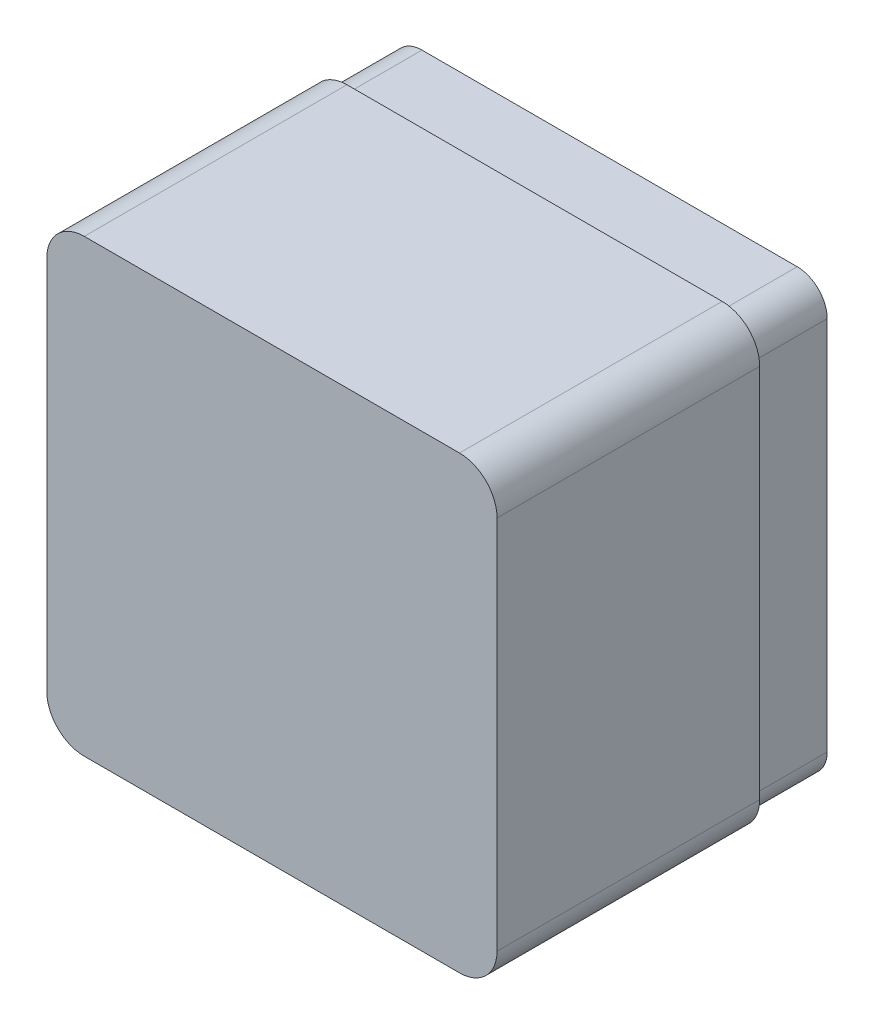
ISO-10303-21;
HEADER;
FILE_DESCRIPTION(('STEP AP214'),'2;1');
FILE_NAME('part.step','',(''),(''),'','','');
FILE_SCHEMA(('AUTOMOTIVE_DESIGN { 1 0 10303 214 1 1 1 1 }'));
ENDSEC;
DATA;
#1=APPLICATION_CONTEXT('core data for automotive mechanical design processes');
#2=APPLICATION_PROTOCOL_DEFINITION('international standard','automotive_design',2000,#1);
#3=PRODUCT_CONTEXT('',#1,'mechanical');
#4=PRODUCT('Part','Part','',(#3));
#5=PRODUCT_RELATED_PRODUCT_CATEGORY('part','',(#4));
#6=PRODUCT_DEFINITION_FORMATION('','',#4);
#7=PRODUCT_DEFINITION_CONTEXT('part definition',#1,'design');
#8=PRODUCT_DEFINITION('design','',#6,#7);
#9=PRODUCT_DEFINITION_SHAPE('','',#8);
#10=(LENGTH_UNIT() NAMED_UNIT(*) SI_UNIT(.MILLI.,.METRE.));
#11=(NAMED_UNIT(*) PLANE_ANGLE_UNIT() SI_UNIT($,.RADIAN.));
#12=(NAMED_UNIT(*) SI_UNIT($,.STERADIAN.) SOLID_ANGLE_UNIT());
#13=UNCERTAINTY_MEASURE_WITH_UNIT(LENGTH_MEASURE(1.E-05),#10,'distance_accuracy_value','');
#14=(GEOMETRIC_REPRESENTATION_CONTEXT(3) GLOBAL_UNCERTAINTY_ASSIGNED_CONTEXT((#13)) GLOBAL_UNIT_ASSIGNED_CONTEXT((#10,
#11,#12)) REPRESENTATION_CONTEXT('',''));
#15=CARTESIAN_POINT('',(0.,0.,0.));
#16=DIRECTION('',(0.,0.,1.));
#17=DIRECTION('',(1.,0.,0.));
#18=AXIS2_PLACEMENT_3D('',#15,#16,#17);
#19=CARTESIAN_POINT('',(0.,0.,0.));
#20=DIRECTION('',(0.,0.,-1.));
#21=DIRECTION('',(-1.,0.,0.));
#22=AXIS2_PLACEMENT_3D('',#19,#20,#21);
#23=PLANE('',#22);
#24=CARTESIAN_POINT('',(10.,10.,0.));
#25=DIRECTION('',(0.,0.,-1.));
#26=DIRECTION('',(-1.,0.,0.));
#27=AXIS2_PLACEMENT_3D('',#24,#25,#26);
#28=CIRCLE('',#27,6.);
#29=CARTESIAN_POINT('',(10.,4.,0.));
#30=VERTEX_POINT('',#29);
#31=CARTESIAN_POINT('',(4.,9.99999999999999,0.));
#32=VERTEX_POINT('',#31);
#33=EDGE_CURVE('E334',#30,#32,#28,.T.);
#34=ORIENTED_EDGE('',*,*,#33,.F.);
#35=DIRECTION('',(1.,0.,0.));
#36=VECTOR('',#35,1.);
#37=CARTESIAN_POINT('',(0.,4.,0.));
#38=LINE('',#37,#36);
#39=CARTESIAN_POINT('',(110.,4.,0.));
#40=VERTEX_POINT('',#39);
#41=EDGE_CURVE('E381',#30,#40,#38,.T.);
#42=ORIENTED_EDGE('',*,*,#41,.T.);
#43=CARTESIAN_POINT('',(110.,10.,0.));
#44=DIRECTION('',(0.,0.,-1.));
#45=DIRECTION('',(-1.,0.,0.));
#46=AXIS2_PLACEMENT_3D('',#43,#44,#45);
#47=CIRCLE('',#46,6.);
#48=CARTESIAN_POINT('',(116.,10.,0.));
#49=VERTEX_POINT('',#48);
#50=EDGE_CURVE('E391',#49,#40,#47,.T.);
#51=ORIENTED_EDGE('',*,*,#50,.F.);
#52=DIRECTION('',(0.,1.,0.));
#53=VECTOR('',#52,1.);
#54=CARTESIAN_POINT('',(116.,0.,0.));
#55=LINE('',#54,#53);
#56=CARTESIAN_POINT('',(116.,110.,0.));
#57=VERTEX_POINT('',#56);
#58=EDGE_CURVE('E388',#49,#57,#55,.T.);
#59=ORIENTED_EDGE('',*,*,#58,.T.);
#60=CARTESIAN_POINT('',(110.,110.,0.));
#61=DIRECTION('',(0.,0.,-1.));
#62=DIRECTION('',(-1.,0.,0.));
#63=AXIS2_PLACEMENT_3D('',#60,#61,#62);
#64=CIRCLE('',#63,6.);
#65=CARTESIAN_POINT('',(110.,116.,0.));
#66=VERTEX_POINT('',#65);
#67=EDGE_CURVE('E384',#66,#57,#64,.T.);
#68=ORIENTED_EDGE('',*,*,#67,.F.);
#69=DIRECTION('',(-1.,0.,0.));
#70=VECTOR('',#69,1.);
#71=CARTESIAN_POINT('',(0.,116.,0.));
#72=LINE('',#71,#70);
#73=CARTESIAN_POINT('',(9.99999999999999,116.,0.));
#74=VERTEX_POINT('',#73);
#75=EDGE_CURVE('E331',#66,#74,#72,.T.);
#76=ORIENTED_EDGE('',*,*,#75,.T.);
#77=CARTESIAN_POINT('',(10.,110.,0.));
#78=DIRECTION('',(0.,0.,-1.));
#79=DIRECTION('',(-1.,0.,0.));
#80=AXIS2_PLACEMENT_3D('',#77,#78,#79);
#81=CIRCLE('',#80,6.);
#82=CARTESIAN_POINT('',(4.,110.,0.));
#83=VERTEX_POINT('',#82);
#84=EDGE_CURVE('E362',#83,#74,#81,.T.);
#85=ORIENTED_EDGE('',*,*,#84,.F.);
#86=DIRECTION('',(0.,-1.,0.));
#87=VECTOR('',#86,1.);
#88=CARTESIAN_POINT('',(4.,0.,0.));
#89=LINE('',#88,#87);
#90=EDGE_CURVE('E320',#83,#32,#89,.T.);
#91=ORIENTED_EDGE('',*,*,#90,.T.);
#92=EDGE_LOOP('',(#34,#42,#51,#59,#68,#76,#85,#91));
#93=FACE_BOUND('',#92,.T.);
#94=DIRECTION('',(0.,-1.,0.));
#95=VECTOR('',#94,1.);
#96=CARTESIAN_POINT('',(118.,110.,0.));
#97=LINE('',#96,#95);
#98=CARTESIAN_POINT('',(118.,110.,0.));
#99=VERTEX_POINT('',#98);
#100=CARTESIAN_POINT('',(118.,9.99999999999999,0.));
#101=VERTEX_POINT('',#100);
#102=EDGE_CURVE('E229',#99,#101,#97,.T.);
#103=ORIENTED_EDGE('',*,*,#102,.T.);
#104=CARTESIAN_POINT('',(110.,10.,0.));
#105=DIRECTION('',(0.,0.,-1.));
#106=DIRECTION('',(-1.,0.,0.));
#107=AXIS2_PLACEMENT_3D('',#104,#105,#106);
#108=CIRCLE('',#107,7.99999999999998);
#109=CARTESIAN_POINT('',(110.,2.,0.));
#110=VERTEX_POINT('',#109);
#111=EDGE_CURVE('E256',#101,#110,#108,.T.);
#112=ORIENTED_EDGE('',*,*,#111,.T.);
#113=DIRECTION('',(-1.,0.,0.));
#114=VECTOR('',#113,1.);
#115=CARTESIAN_POINT('',(110.,2.,0.));
#116=LINE('',#115,#114);
#117=CARTESIAN_POINT('',(9.99999999999999,2.,0.));
#118=VERTEX_POINT('',#117);
#119=EDGE_CURVE('E206',#110,#118,#116,.T.);
#120=ORIENTED_EDGE('',*,*,#119,.T.);
#121=CARTESIAN_POINT('',(10.,10.,0.));
#122=DIRECTION('',(0.,0.,-1.));
#123=DIRECTION('',(-1.,0.,0.));
#124=AXIS2_PLACEMENT_3D('',#121,#122,#123);
#125=CIRCLE('',#124,8.);
#126=CARTESIAN_POINT('',(2.,10.,0.));
#127=VERTEX_POINT('',#126);
#128=EDGE_CURVE('E54',#118,#127,#125,.T.);
#129=ORIENTED_EDGE('',*,*,#128,.T.);
#130=DIRECTION('',(0.,1.,0.));
#131=VECTOR('',#130,1.);
#132=CARTESIAN_POINT('',(2.,10.,0.));
#133=LINE('',#132,#131);
#134=CARTESIAN_POINT('',(2.,110.,0.));
#135=VERTEX_POINT('',#134);
#136=EDGE_CURVE('E263',#127,#135,#133,.T.);
#137=ORIENTED_EDGE('',*,*,#136,.T.);
#138=CARTESIAN_POINT('',(10.,110.,0.));
#139=DIRECTION('',(0.,0.,-1.));
#140=DIRECTION('',(-1.,0.,0.));
#141=AXIS2_PLACEMENT_3D('',#138,#139,#140);
#142=CIRCLE('',#141,8.);
#143=CARTESIAN_POINT('',(10.,118.,0.));
#144=VERTEX_POINT('',#143);
#145=EDGE_CURVE('E267',#135,#144,#142,.T.);
#146=ORIENTED_EDGE('',*,*,#145,.T.);
#147=DIRECTION('',(1.,0.,0.));
#148=VECTOR('',#147,1.);
#149=CARTESIAN_POINT('',(10.,118.,0.));
#150=LINE('',#149,#148);
#151=CARTESIAN_POINT('',(110.,118.,0.));
#152=VERTEX_POINT('',#151);
#153=EDGE_CURVE('E271',#144,#152,#150,.T.);
#154=ORIENTED_EDGE('',*,*,#153,.T.);
#155=CARTESIAN_POINT('',(110.,110.,0.));
#156=DIRECTION('',(0.,0.,-1.));
#157=DIRECTION('',(-1.,0.,0.));
#158=AXIS2_PLACEMENT_3D('',#155,#156,#157);
#159=CIRCLE('',#158,7.99999999999999);
#160=EDGE_CURVE('E233',#152,#99,#159,.T.);
#161=ORIENTED_EDGE('',*,*,#160,.T.);
#162=EDGE_LOOP('',(#103,#112,#120,#129,#137,#146,#154,#161));
#163=FACE_BOUND('',#162,.T.);
#164=ADVANCED_FACE('F38',(#93,#163),#23,.T.);
#165=CARTESIAN_POINT('',(4.,0.,90.));
#166=DIRECTION('',(1.,0.,0.));
#167=DIRECTION('',(0.,0.,-1.));
#168=AXIS2_PLACEMENT_3D('',#165,#166,#167);
#169=PLANE('',#168);
#170=ORIENTED_EDGE('',*,*,#90,.F.);
#171=DIRECTION('',(0.,0.,-1.));
#172=VECTOR('',#171,1.);
#173=CARTESIAN_POINT('',(4.,110.,90.));
#174=LINE('',#173,#172);
#175=CARTESIAN_POINT('',(4.,110.,86.));
#176=VERTEX_POINT('',#175);
#177=EDGE_CURVE('E325',#176,#83,#174,.T.);
#178=ORIENTED_EDGE('',*,*,#177,.F.);
#179=DIRECTION('',(0.,-1.,0.));
#180=VECTOR('',#179,1.);
#181=CARTESIAN_POINT('',(4.,0.,86.));
#182=LINE('',#181,#180);
#183=CARTESIAN_POINT('',(4.,9.99999999999999,86.));
#184=VERTEX_POINT('',#183);
#185=EDGE_CURVE('E326',#176,#184,#182,.T.);
#186=ORIENTED_EDGE('',*,*,#185,.T.);
#187=DIRECTION('',(0.,0.,-1.));
#188=VECTOR('',#187,1.);
#189=CARTESIAN_POINT('',(4.,9.99999999999999,90.));
#190=LINE('',#189,#188);
#191=EDGE_CURVE('E321',#32,#184,#190,.F.);
#192=ORIENTED_EDGE('',*,*,#191,.F.);
#193=EDGE_LOOP('',(#170,#178,#186,#192));
#194=FACE_BOUND('',#193,.T.);
#195=ADVANCED_FACE('F504',(#194),#169,.T.);
#196=CARTESIAN_POINT('',(0.,4.,90.));
#197=DIRECTION('',(0.,1.,0.));
#198=DIRECTION('',(0.,0.,1.));
#199=AXIS2_PLACEMENT_3D('',#196,#197,#198);
#200=PLANE('',#199);
#201=DIRECTION('',(1.,0.,0.));
#202=VECTOR('',#201,1.);
#203=CARTESIAN_POINT('',(0.,4.,86.));
#204=LINE('',#203,#202);
#205=CARTESIAN_POINT('',(9.99999999999999,4.,86.));
#206=VERTEX_POINT('',#205);
#207=CARTESIAN_POINT('',(110.,4.,86.));
#208=VERTEX_POINT('',#207);
#209=EDGE_CURVE('E330',#206,#208,#204,.T.);
#210=ORIENTED_EDGE('',*,*,#209,.T.);
#211=DIRECTION('',(0.,0.,1.));
#212=VECTOR('',#211,1.);
#213=CARTESIAN_POINT('',(110.,4.,90.));
#214=LINE('',#213,#212);
#215=EDGE_CURVE('E356',#40,#208,#214,.T.);
#216=ORIENTED_EDGE('',*,*,#215,.F.);
#217=ORIENTED_EDGE('',*,*,#41,.F.);
#218=DIRECTION('',(0.,0.,1.));
#219=VECTOR('',#218,1.);
#220=CARTESIAN_POINT('',(9.99999999999999,4.,90.));
#221=LINE('',#220,#219);
#222=EDGE_CURVE('E359',#206,#30,#221,.F.);
#223=ORIENTED_EDGE('',*,*,#222,.F.);
#224=EDGE_LOOP('',(#210,#216,#217,#223));
#225=FACE_BOUND('',#224,.T.);
#226=ADVANCED_FACE('F511',(#225),#200,.T.);
#227=CARTESIAN_POINT('',(116.,0.,90.));
#228=DIRECTION('',(-1.,0.,0.));
#229=DIRECTION('',(0.,-1.,0.));
#230=AXIS2_PLACEMENT_3D('',#227,#228,#229);
#231=PLANE('',#230);
#232=DIRECTION('',(0.,1.,0.));
#233=VECTOR('',#232,1.);
#234=CARTESIAN_POINT('',(116.,0.,86.));
#235=LINE('',#234,#233);
#236=CARTESIAN_POINT('',(116.,10.,86.));
#237=VERTEX_POINT('',#236);
#238=CARTESIAN_POINT('',(116.,110.,86.));
#239=VERTEX_POINT('',#238);
#240=EDGE_CURVE('E343',#237,#239,#235,.T.);
#241=ORIENTED_EDGE('',*,*,#240,.T.);
#242=DIRECTION('',(0.,0.,1.));
#243=VECTOR('',#242,1.);
#244=CARTESIAN_POINT('',(116.,110.,90.));
#245=LINE('',#244,#243);
#246=EDGE_CURVE('E338',#57,#239,#245,.T.);
#247=ORIENTED_EDGE('',*,*,#246,.F.);
#248=ORIENTED_EDGE('',*,*,#58,.F.);
#249=DIRECTION('',(0.,0.,1.));
#250=VECTOR('',#249,1.);
#251=CARTESIAN_POINT('',(116.,10.,90.));
#252=LINE('',#251,#250);
#253=EDGE_CURVE('E365',#237,#49,#252,.F.);
#254=ORIENTED_EDGE('',*,*,#253,.F.);
#255=EDGE_LOOP('',(#241,#247,#248,#254));
#256=FACE_BOUND('',#255,.T.);
#257=ADVANCED_FACE('F685',(#256),#231,.T.);
#258=CARTESIAN_POINT('',(0.,116.,90.));
#259=DIRECTION('',(0.,-1.,0.));
#260=DIRECTION('',(0.,0.,-1.));
#261=AXIS2_PLACEMENT_3D('',#258,#259,#260);
#262=PLANE('',#261);
#263=DIRECTION('',(-1.,0.,0.));
#264=VECTOR('',#263,1.);
#265=CARTESIAN_POINT('',(0.,116.,86.));
#266=LINE('',#265,#264);
#267=CARTESIAN_POINT('',(110.,116.,86.));
#268=VERTEX_POINT('',#267);
#269=CARTESIAN_POINT('',(9.99999999999999,116.,86.));
#270=VERTEX_POINT('',#269);
#271=EDGE_CURVE('E350',#268,#270,#266,.T.);
#272=ORIENTED_EDGE('',*,*,#271,.T.);
#273=DIRECTION('',(0.,0.,-1.));
#274=VECTOR('',#273,1.);
#275=CARTESIAN_POINT('',(9.99999999999999,116.,90.));
#276=LINE('',#275,#274);
#277=EDGE_CURVE('E369',#74,#270,#276,.F.);
#278=ORIENTED_EDGE('',*,*,#277,.F.);
#279=ORIENTED_EDGE('',*,*,#75,.F.);
#280=DIRECTION('',(0.,0.,-1.));
#281=VECTOR('',#280,1.);
#282=CARTESIAN_POINT('',(110.,116.,90.));
#283=LINE('',#282,#281);
#284=EDGE_CURVE('E372',#268,#66,#283,.T.);
#285=ORIENTED_EDGE('',*,*,#284,.F.);
#286=EDGE_LOOP('',(#272,#278,#279,#285));
#287=FACE_BOUND('',#286,.T.);
#288=ADVANCED_FACE('F677',(#287),#262,.T.);
#289=CARTESIAN_POINT('',(0.,0.,86.));
#290=DIRECTION('',(0.,0.,-1.));
#291=DIRECTION('',(-1.,0.,0.));
#292=AXIS2_PLACEMENT_3D('',#289,#290,#291);
#293=PLANE('',#292);
#294=ORIENTED_EDGE('',*,*,#185,.F.);
#295=CARTESIAN_POINT('',(10.,110.,86.));
#296=DIRECTION('',(0.,0.,-1.));
#297=DIRECTION('',(-1.,0.,0.));
#298=AXIS2_PLACEMENT_3D('',#295,#296,#297);
#299=CIRCLE('',#298,6.);
#300=EDGE_CURVE('E324',#270,#176,#299,.F.);
#301=ORIENTED_EDGE('',*,*,#300,.F.);
#302=ORIENTED_EDGE('',*,*,#271,.F.);
#303=CARTESIAN_POINT('',(110.,110.,86.));
#304=DIRECTION('',(0.,0.,-1.));
#305=DIRECTION('',(-1.,0.,0.));
#306=AXIS2_PLACEMENT_3D('',#303,#304,#305);
#307=CIRCLE('',#306,6.);
#308=EDGE_CURVE('E346',#239,#268,#307,.F.);
#309=ORIENTED_EDGE('',*,*,#308,.F.);
#310=ORIENTED_EDGE('',*,*,#240,.F.);
#311=CARTESIAN_POINT('',(110.,10.,86.));
#312=DIRECTION('',(0.,0.,-1.));
#313=DIRECTION('',(-1.,0.,0.));
#314=AXIS2_PLACEMENT_3D('',#311,#312,#313);
#315=CIRCLE('',#314,6.);
#316=EDGE_CURVE('E339',#208,#237,#315,.F.);
#317=ORIENTED_EDGE('',*,*,#316,.F.);
#318=ORIENTED_EDGE('',*,*,#209,.F.);
#319=CARTESIAN_POINT('',(10.,10.,86.));
#320=DIRECTION('',(0.,0.,-1.));
#321=DIRECTION('',(-1.,0.,0.));
#322=AXIS2_PLACEMENT_3D('',#319,#320,#321);
#323=CIRCLE('',#322,6.);
#324=EDGE_CURVE('E335',#184,#206,#323,.F.);
#325=ORIENTED_EDGE('',*,*,#324,.F.);
#326=EDGE_LOOP('',(#294,#301,#302,#309,#310,#317,#318,#325));
#327=FACE_BOUND('',#326,.T.);
#328=ADVANCED_FACE('F669',(#327),#293,.T.);
#329=CARTESIAN_POINT('',(10.,10.,90.));
#330=DIRECTION('',(0.,0.,-1.));
#331=DIRECTION('',(-1.,0.,0.));
#332=AXIS2_PLACEMENT_3D('',#329,#330,#331);
#333=CYLINDRICAL_SURFACE('',#332,6.);
#334=ORIENTED_EDGE('',*,*,#324,.T.);
#335=ORIENTED_EDGE('',*,*,#222,.T.);
#336=ORIENTED_EDGE('',*,*,#33,.T.);
#337=ORIENTED_EDGE('',*,*,#191,.T.);
#338=EDGE_LOOP('',(#334,#335,#336,#337));
#339=FACE_BOUND('',#338,.T.);
#340=ADVANCED_FACE('F661',(#339),#333,.F.);
#341=CARTESIAN_POINT('',(110.,10.,90.));
#342=DIRECTION('',(0.,0.,-1.));
#343=DIRECTION('',(-1.,0.,0.));
#344=AXIS2_PLACEMENT_3D('',#341,#342,#343);
#345=CYLINDRICAL_SURFACE('',#344,6.);
#346=ORIENTED_EDGE('',*,*,#316,.T.);
#347=ORIENTED_EDGE('',*,*,#253,.T.);
#348=ORIENTED_EDGE('',*,*,#50,.T.);
#349=ORIENTED_EDGE('',*,*,#215,.T.);
#350=EDGE_LOOP('',(#346,#347,#348,#349));
#351=FACE_BOUND('',#350,.T.);
#352=ADVANCED_FACE('F653',(#351),#345,.F.);
#353=CARTESIAN_POINT('',(110.,110.,90.));
#354=DIRECTION('',(0.,0.,-1.));
#355=DIRECTION('',(-1.,0.,0.));
#356=AXIS2_PLACEMENT_3D('',#353,#354,#355);
#357=CYLINDRICAL_SURFACE('',#356,6.);
#358=ORIENTED_EDGE('',*,*,#308,.T.);
#359=ORIENTED_EDGE('',*,*,#284,.T.);
#360=ORIENTED_EDGE('',*,*,#67,.T.);
#361=ORIENTED_EDGE('',*,*,#246,.T.);
#362=EDGE_LOOP('',(#358,#359,#360,#361));
#363=FACE_BOUND('',#362,.T.);
#364=ADVANCED_FACE('F499',(#363),#357,.F.);
#365=CARTESIAN_POINT('',(10.,110.,90.));
#366=DIRECTION('',(0.,0.,-1.));
#367=DIRECTION('',(-1.,0.,0.));
#368=AXIS2_PLACEMENT_3D('',#365,#366,#367);
#369=CYLINDRICAL_SURFACE('',#368,6.);
#370=ORIENTED_EDGE('',*,*,#300,.T.);
#371=ORIENTED_EDGE('',*,*,#177,.T.);
#372=ORIENTED_EDGE('',*,*,#84,.T.);
#373=ORIENTED_EDGE('',*,*,#277,.T.);
#374=EDGE_LOOP('',(#370,#371,#372,#373));
#375=FACE_BOUND('',#374,.T.);
#376=ADVANCED_FACE('F490',(#375),#369,.F.);
#377=CARTESIAN_POINT('',(110.,10.,20.));
#378=DIRECTION('',(0.,0.,-1.));
#379=DIRECTION('',(-1.,0.,0.));
#380=AXIS2_PLACEMENT_3D('',#377,#378,#379);
#381=PLANE('',#380);
#382=DIRECTION('',(0.,-1.,0.));
#383=VECTOR('',#382,1.);
#384=CARTESIAN_POINT('',(118.,110.,20.));
#385=LINE('',#384,#383);
#386=CARTESIAN_POINT('',(118.,110.,20.));
#387=VERTEX_POINT('',#386);
#388=CARTESIAN_POINT('',(118.,9.99999999999999,20.));
#389=VERTEX_POINT('',#388);
#390=EDGE_CURVE('E213',#387,#389,#385,.T.);
#391=ORIENTED_EDGE('',*,*,#390,.F.);
#392=CARTESIAN_POINT('',(110.,110.,20.));
#393=DIRECTION('',(0.,0.,-1.));
#394=DIRECTION('',(-1.,0.,0.));
#395=AXIS2_PLACEMENT_3D('',#392,#393,#394);
#396=CIRCLE('',#395,7.99999999999999);
#397=CARTESIAN_POINT('',(110.,118.,20.));
#398=VERTEX_POINT('',#397);
#399=EDGE_CURVE('E250',#398,#387,#396,.T.);
#400=ORIENTED_EDGE('',*,*,#399,.F.);
#401=DIRECTION('',(1.,0.,0.));
#402=VECTOR('',#401,1.);
#403=CARTESIAN_POINT('',(10.,118.,20.));
#404=LINE('',#403,#402);
#405=CARTESIAN_POINT('',(10.,118.,20.));
#406=VERTEX_POINT('',#405);
#407=EDGE_CURVE('E246',#406,#398,#404,.T.);
#408=ORIENTED_EDGE('',*,*,#407,.F.);
#409=CARTESIAN_POINT('',(10.,110.,20.));
#410=DIRECTION('',(0.,0.,-1.));
#411=DIRECTION('',(-1.,0.,0.));
#412=AXIS2_PLACEMENT_3D('',#409,#410,#411);
#413=CIRCLE('',#412,8.);
#414=CARTESIAN_POINT('',(2.,110.,20.));
#415=VERTEX_POINT('',#414);
#416=EDGE_CURVE('E242',#415,#406,#413,.T.);
#417=ORIENTED_EDGE('',*,*,#416,.F.);
#418=DIRECTION('',(0.,1.,0.));
#419=VECTOR('',#418,1.);
#420=CARTESIAN_POINT('',(2.,10.,20.));
#421=LINE('',#420,#419);
#422=CARTESIAN_POINT('',(2.,10.,20.));
#423=VERTEX_POINT('',#422);
#424=EDGE_CURVE('E238',#423,#415,#421,.T.);
#425=ORIENTED_EDGE('',*,*,#424,.F.);
#426=CARTESIAN_POINT('',(10.,10.,20.));
#427=DIRECTION('',(0.,0.,-1.));
#428=DIRECTION('',(-1.,0.,0.));
#429=AXIS2_PLACEMENT_3D('',#426,#427,#428);
#430=CIRCLE('',#429,8.);
#431=CARTESIAN_POINT('',(9.99999999999999,2.,20.));
#432=VERTEX_POINT('',#431);
#433=EDGE_CURVE('E223',#432,#423,#430,.T.);
#434=ORIENTED_EDGE('',*,*,#433,.F.);
#435=DIRECTION('',(-1.,0.,0.));
#436=VECTOR('',#435,1.);
#437=CARTESIAN_POINT('',(110.,2.,20.));
#438=LINE('',#437,#436);
#439=CARTESIAN_POINT('',(110.,2.,20.));
#440=VERTEX_POINT('',#439);
#441=EDGE_CURVE('E204',#440,#432,#438,.T.);
#442=ORIENTED_EDGE('',*,*,#441,.F.);
#443=CARTESIAN_POINT('',(110.,10.,20.));
#444=DIRECTION('',(0.,0.,-1.));
#445=DIRECTION('',(-1.,0.,0.));
#446=AXIS2_PLACEMENT_3D('',#443,#444,#445);
#447=CIRCLE('',#446,7.99999999999998);
#448=EDGE_CURVE('E219',#389,#440,#447,.T.);
#449=ORIENTED_EDGE('',*,*,#448,.F.);
#450=EDGE_LOOP('',(#391,#400,#408,#417,#425,#434,#442,#449));
#451=FACE_BOUND('',#450,.T.);
#452=CARTESIAN_POINT('',(110.,10.,20.));
#453=DIRECTION('',(0.,0.,-1.));
#454=DIRECTION('',(-1.,0.,0.));
#455=AXIS2_PLACEMENT_3D('',#452,#453,#454);
#456=CIRCLE('',#455,9.99999999999999);
#457=CARTESIAN_POINT('',(120.,10.,20.));
#458=VERTEX_POINT('',#457);
#459=CARTESIAN_POINT('',(110.,0.,20.));
#460=VERTEX_POINT('',#459);
#461=EDGE_CURVE('E280',#458,#460,#456,.T.);
#462=ORIENTED_EDGE('',*,*,#461,.T.);
#463=DIRECTION('',(-1.,0.,0.));
#464=VECTOR('',#463,1.);
#465=CARTESIAN_POINT('',(110.,0.,20.));
#466=LINE('',#465,#464);
#467=CARTESIAN_POINT('',(10.,0.,20.));
#468=VERTEX_POINT('',#467);
#469=EDGE_CURVE('E300',#460,#468,#466,.T.);
#470=ORIENTED_EDGE('',*,*,#469,.T.);
#471=CARTESIAN_POINT('',(10.,10.,20.));
#472=DIRECTION('',(0.,0.,-1.));
#473=DIRECTION('',(-1.,0.,0.));
#474=AXIS2_PLACEMENT_3D('',#471,#472,#473);
#475=CIRCLE('',#474,10.);
#476=CARTESIAN_POINT('',(0.,10.,20.));
#477=VERTEX_POINT('',#476);
#478=EDGE_CURVE('E303',#468,#477,#475,.T.);
#479=ORIENTED_EDGE('',*,*,#478,.T.);
#480=DIRECTION('',(0.,1.,0.));
#481=VECTOR('',#480,1.);
#482=CARTESIAN_POINT('',(0.,10.,20.));
#483=LINE('',#482,#481);
#484=CARTESIAN_POINT('',(0.,110.,20.));
#485=VERTEX_POINT('',#484);
#486=EDGE_CURVE('E62',#477,#485,#483,.T.);
#487=ORIENTED_EDGE('',*,*,#486,.T.);
#488=CARTESIAN_POINT('',(10.,110.,20.));
#489=DIRECTION('',(0.,0.,-1.));
#490=DIRECTION('',(-1.,0.,0.));
#491=AXIS2_PLACEMENT_3D('',#488,#489,#490);
#492=CIRCLE('',#491,10.);
#493=CARTESIAN_POINT('',(10.,120.,20.));
#494=VERTEX_POINT('',#493);
#495=EDGE_CURVE('E308',#485,#494,#492,.T.);
#496=ORIENTED_EDGE('',*,*,#495,.T.);
#497=DIRECTION('',(1.,0.,0.));
#498=VECTOR('',#497,1.);
#499=CARTESIAN_POINT('',(10.,120.,20.));
#500=LINE('',#499,#498);
#501=CARTESIAN_POINT('',(110.,120.,20.));
#502=VERTEX_POINT('',#501);
#503=EDGE_CURVE('E311',#494,#502,#500,.T.);
#504=ORIENTED_EDGE('',*,*,#503,.T.);
#505=CARTESIAN_POINT('',(110.,110.,20.));
#506=DIRECTION('',(0.,0.,-1.));
#507=DIRECTION('',(-1.,0.,0.));
#508=AXIS2_PLACEMENT_3D('',#505,#506,#507);
#509=CIRCLE('',#508,9.99999999999999);
#510=CARTESIAN_POINT('',(120.,110.,20.));
#511=VERTEX_POINT('',#510);
#512=EDGE_CURVE('E314',#502,#511,#509,.T.);
#513=ORIENTED_EDGE('',*,*,#512,.T.);
#514=DIRECTION('',(0.,-1.,0.));
#515=VECTOR('',#514,1.);
#516=CARTESIAN_POINT('',(120.,110.,20.));
#517=LINE('',#516,#515);
#518=EDGE_CURVE('E317',#511,#458,#517,.T.);
#519=ORIENTED_EDGE('',*,*,#518,.T.);
#520=EDGE_LOOP('',(#462,#470,#479,#487,#496,#504,#513,#519));
#521=FACE_BOUND('',#520,.T.);
#522=ADVANCED_FACE('F218',(#451,#521),#381,.T.);
#523=CARTESIAN_POINT('',(110.,10.,20.));
#524=DIRECTION('',(0.,0.,-1.));
#525=DIRECTION('',(-1.,0.,0.));
#526=AXIS2_PLACEMENT_3D('',#523,#524,#525);
#527=CYLINDRICAL_SURFACE('',#526,7.99999999999998);
#528=ORIENTED_EDGE('',*,*,#111,.F.);
#529=DIRECTION('',(0.,0.,-1.));
#530=VECTOR('',#529,1.);
#531=CARTESIAN_POINT('',(118.,9.99999999999999,20.));
#532=LINE('',#531,#530);
#533=EDGE_CURVE('E227',#389,#101,#532,.T.);
#534=ORIENTED_EDGE('',*,*,#533,.F.);
#535=ORIENTED_EDGE('',*,*,#448,.T.);
#536=DIRECTION('',(0.,0.,-1.));
#537=VECTOR('',#536,1.);
#538=CARTESIAN_POINT('',(110.,2.,20.));
#539=LINE('',#538,#537);
#540=EDGE_CURVE('E201',#440,#110,#539,.T.);
#541=ORIENTED_EDGE('',*,*,#540,.T.);
#542=EDGE_LOOP('',(#528,#534,#535,#541));
#543=FACE_BOUND('',#542,.T.);
#544=ADVANCED_FACE('F226',(#543),#527,.T.);
#545=CARTESIAN_POINT('',(118.,110.,20.));
#546=DIRECTION('',(1.,0.,0.));
#547=DIRECTION('',(0.,0.,-1.));
#548=AXIS2_PLACEMENT_3D('',#545,#546,#547);
#549=PLANE('',#548);
#550=ORIENTED_EDGE('',*,*,#102,.F.);
#551=DIRECTION('',(0.,0.,-1.));
#552=VECTOR('',#551,1.);
#553=CARTESIAN_POINT('',(118.,110.,20.));
#554=LINE('',#553,#552);
#555=EDGE_CURVE('E281',#387,#99,#554,.T.);
#556=ORIENTED_EDGE('',*,*,#555,.F.);
#557=ORIENTED_EDGE('',*,*,#390,.T.);
#558=ORIENTED_EDGE('',*,*,#533,.T.);
#559=EDGE_LOOP('',(#550,#556,#557,#558));
#560=FACE_BOUND('',#559,.T.);
#561=ADVANCED_FACE('F496',(#560),#549,.T.);
#562=CARTESIAN_POINT('',(110.,110.,20.));
#563=DIRECTION('',(0.,0.,-1.));
#564=DIRECTION('',(-1.,0.,0.));
#565=AXIS2_PLACEMENT_3D('',#562,#563,#564);
#566=CYLINDRICAL_SURFACE('',#565,7.99999999999999);
#567=ORIENTED_EDGE('',*,*,#160,.F.);
#568=DIRECTION('',(0.,0.,-1.));
#569=VECTOR('',#568,1.);
#570=CARTESIAN_POINT('',(110.,118.,20.));
#571=LINE('',#570,#569);
#572=EDGE_CURVE('E284',#398,#152,#571,.T.);
#573=ORIENTED_EDGE('',*,*,#572,.F.);
#574=ORIENTED_EDGE('',*,*,#399,.T.);
#575=ORIENTED_EDGE('',*,*,#555,.T.);
#576=EDGE_LOOP('',(#567,#573,#574,#575));
#577=FACE_BOUND('',#576,.T.);
#578=ADVANCED_FACE('F578',(#577),#566,.T.);
#579=CARTESIAN_POINT('',(10.,118.,20.));
#580=DIRECTION('',(0.,1.,0.));
#581=DIRECTION('',(0.,0.,1.));
#582=AXIS2_PLACEMENT_3D('',#579,#580,#581);
#583=PLANE('',#582);
#584=ORIENTED_EDGE('',*,*,#153,.F.);
#585=DIRECTION('',(0.,0.,-1.));
#586=VECTOR('',#585,1.);
#587=CARTESIAN_POINT('',(10.,118.,20.));
#588=LINE('',#587,#586);
#589=EDGE_CURVE('E287',#406,#144,#588,.T.);
#590=ORIENTED_EDGE('',*,*,#589,.F.);
#591=ORIENTED_EDGE('',*,*,#407,.T.);
#592=ORIENTED_EDGE('',*,*,#572,.T.);
#593=EDGE_LOOP('',(#584,#590,#591,#592));
#594=FACE_BOUND('',#593,.T.);
#595=ADVANCED_FACE('F587',(#594),#583,.T.);
#596=CARTESIAN_POINT('',(10.,110.,20.));
#597=DIRECTION('',(0.,0.,-1.));
#598=DIRECTION('',(-1.,0.,0.));
#599=AXIS2_PLACEMENT_3D('',#596,#597,#598);
#600=CYLINDRICAL_SURFACE('',#599,8.);
#601=ORIENTED_EDGE('',*,*,#145,.F.);
#602=DIRECTION('',(0.,0.,-1.));
#603=VECTOR('',#602,1.);
#604=CARTESIAN_POINT('',(2.,110.,20.));
#605=LINE('',#604,#603);
#606=EDGE_CURVE('E290',#415,#135,#605,.T.);
#607=ORIENTED_EDGE('',*,*,#606,.F.);
#608=ORIENTED_EDGE('',*,*,#416,.T.);
#609=ORIENTED_EDGE('',*,*,#589,.T.);
#610=EDGE_LOOP('',(#601,#607,#608,#609));
#611=FACE_BOUND('',#610,.T.);
#612=ADVANCED_FACE('F596',(#611),#600,.T.);
#613=CARTESIAN_POINT('',(2.,10.,20.));
#614=DIRECTION('',(-1.,0.,0.));
#615=DIRECTION('',(0.,-1.,0.));
#616=AXIS2_PLACEMENT_3D('',#613,#614,#615);
#617=PLANE('',#616);
#618=ORIENTED_EDGE('',*,*,#136,.F.);
#619=DIRECTION('',(0.,0.,-1.));
#620=VECTOR('',#619,1.);
#621=CARTESIAN_POINT('',(2.,10.,20.));
#622=LINE('',#621,#620);
#623=EDGE_CURVE('E293',#423,#127,#622,.T.);
#624=ORIENTED_EDGE('',*,*,#623,.F.);
#625=ORIENTED_EDGE('',*,*,#424,.T.);
#626=ORIENTED_EDGE('',*,*,#606,.T.);
#627=EDGE_LOOP('',(#618,#624,#625,#626));
#628=FACE_BOUND('',#627,.T.);
#629=ADVANCED_FACE('F605',(#628),#617,.T.);
#630=CARTESIAN_POINT('',(10.,10.,20.));
#631=DIRECTION('',(0.,0.,-1.));
#632=DIRECTION('',(-1.,0.,0.));
#633=AXIS2_PLACEMENT_3D('',#630,#631,#632);
#634=CYLINDRICAL_SURFACE('',#633,8.);
#635=ORIENTED_EDGE('',*,*,#128,.F.);
#636=DIRECTION('',(0.,0.,-1.));
#637=VECTOR('',#636,1.);
#638=CARTESIAN_POINT('',(9.99999999999999,2.,20.));
#639=LINE('',#638,#637);
#640=EDGE_CURVE('E212',#432,#118,#639,.T.);
#641=ORIENTED_EDGE('',*,*,#640,.F.);
#642=ORIENTED_EDGE('',*,*,#433,.T.);
#643=ORIENTED_EDGE('',*,*,#623,.T.);
#644=EDGE_LOOP('',(#635,#641,#642,#643));
#645=FACE_BOUND('',#644,.T.);
#646=ADVANCED_FACE('F614',(#645),#634,.T.);
#647=CARTESIAN_POINT('',(110.,2.,20.));
#648=DIRECTION('',(0.,-1.,0.));
#649=DIRECTION('',(0.,0.,-1.));
#650=AXIS2_PLACEMENT_3D('',#647,#648,#649);
#651=PLANE('',#650);
#652=ORIENTED_EDGE('',*,*,#119,.F.);
#653=ORIENTED_EDGE('',*,*,#540,.F.);
#654=ORIENTED_EDGE('',*,*,#441,.T.);
#655=ORIENTED_EDGE('',*,*,#640,.T.);
#656=EDGE_LOOP('',(#652,#653,#654,#655));
#657=FACE_BOUND('',#656,.T.);
#658=ADVANCED_FACE('F203',(#657),#651,.T.);
#659=CARTESIAN_POINT('',(0.,0.,90.));
#660=DIRECTION('',(0.,0.,-1.));
#661=DIRECTION('',(-1.,0.,0.));
#662=AXIS2_PLACEMENT_3D('',#659,#660,#661);
#663=PLANE('',#662);
#664=DIRECTION('',(0.,-1.,0.));
#665=VECTOR('',#664,1.);
#666=CARTESIAN_POINT('',(0.,0.,90.));
#667=LINE('',#666,#665);
#668=CARTESIAN_POINT('',(0.,110.,90.));
#669=VERTEX_POINT('',#668);
#670=CARTESIAN_POINT('',(0.,10.,90.));
#671=VERTEX_POINT('',#670);
#672=EDGE_CURVE('E375',#669,#671,#667,.T.);
#673=ORIENTED_EDGE('',*,*,#672,.T.);
#674=CARTESIAN_POINT('',(10.,10.,90.));
#675=DIRECTION('',(0.,0.,-1.));
#676=DIRECTION('',(-1.,0.,0.));
#677=AXIS2_PLACEMENT_3D('',#674,#675,#676);
#678=CIRCLE('',#677,10.);
#679=CARTESIAN_POINT('',(10.,0.,90.));
#680=VERTEX_POINT('',#679);
#681=EDGE_CURVE('E440',#671,#680,#678,.F.);
#682=ORIENTED_EDGE('',*,*,#681,.T.);
#683=DIRECTION('',(1.,0.,0.));
#684=VECTOR('',#683,1.);
#685=CARTESIAN_POINT('',(0.,0.,90.));
#686=LINE('',#685,#684);
#687=CARTESIAN_POINT('',(110.,0.,90.));
#688=VERTEX_POINT('',#687);
#689=EDGE_CURVE('E405',#680,#688,#686,.T.);
#690=ORIENTED_EDGE('',*,*,#689,.T.);
#691=CARTESIAN_POINT('',(110.,10.,90.));
#692=DIRECTION('',(0.,0.,-1.));
#693=DIRECTION('',(-1.,0.,0.));
#694=AXIS2_PLACEMENT_3D('',#691,#692,#693);
#695=CIRCLE('',#694,10.);
#696=CARTESIAN_POINT('',(120.,10.,90.));
#697=VERTEX_POINT('',#696);
#698=EDGE_CURVE('E437',#688,#697,#695,.F.);
#699=ORIENTED_EDGE('',*,*,#698,.T.);
#700=DIRECTION('',(0.,1.,0.));
#701=VECTOR('',#700,1.);
#702=CARTESIAN_POINT('',(120.,0.,90.));
#703=LINE('',#702,#701);
#704=CARTESIAN_POINT('',(120.,110.,90.));
#705=VERTEX_POINT('',#704);
#706=EDGE_CURVE('E409',#697,#705,#703,.T.);
#707=ORIENTED_EDGE('',*,*,#706,.T.);
#708=CARTESIAN_POINT('',(110.,110.,90.));
#709=DIRECTION('',(0.,0.,-1.));
#710=DIRECTION('',(-1.,0.,0.));
#711=AXIS2_PLACEMENT_3D('',#708,#709,#710);
#712=CIRCLE('',#711,10.);
#713=CARTESIAN_POINT('',(110.,120.,90.));
#714=VERTEX_POINT('',#713);
#715=EDGE_CURVE('E434',#705,#714,#712,.F.);
#716=ORIENTED_EDGE('',*,*,#715,.T.);
#717=DIRECTION('',(-1.,0.,0.));
#718=VECTOR('',#717,1.);
#719=CARTESIAN_POINT('',(0.,120.,90.));
#720=LINE('',#719,#718);
#721=CARTESIAN_POINT('',(10.,120.,90.));
#722=VERTEX_POINT('',#721);
#723=EDGE_CURVE('E413',#714,#722,#720,.T.);
#724=ORIENTED_EDGE('',*,*,#723,.T.);
#725=CARTESIAN_POINT('',(10.,110.,90.));
#726=DIRECTION('',(0.,0.,-1.));
#727=DIRECTION('',(-1.,0.,0.));
#728=AXIS2_PLACEMENT_3D('',#725,#726,#727);
#729=CIRCLE('',#728,10.);
#730=EDGE_CURVE('E431',#722,#669,#729,.F.);
#731=ORIENTED_EDGE('',*,*,#730,.T.);
#732=EDGE_LOOP('',(#673,#682,#690,#699,#707,#716,#724,#731));
#733=FACE_BOUND('',#732,.T.);
#734=ADVANCED_FACE('F459',(#733),#663,.F.);
#735=CARTESIAN_POINT('',(10.,10.,90.));
#736=DIRECTION('',(0.,0.,-1.));
#737=DIRECTION('',(-1.,0.,0.));
#738=AXIS2_PLACEMENT_3D('',#735,#736,#737);
#739=CYLINDRICAL_SURFACE('',#738,10.);
#740=DIRECTION('',(0.,0.,-1.));
#741=VECTOR('',#740,1.);
#742=CARTESIAN_POINT('',(0.,10.,90.));
#743=LINE('',#742,#741);
#744=EDGE_CURVE('E428',#477,#671,#743,.F.);
#745=ORIENTED_EDGE('',*,*,#744,.F.);
#746=ORIENTED_EDGE('',*,*,#478,.F.);
#747=DIRECTION('',(0.,0.,-1.));
#748=VECTOR('',#747,1.);
#749=CARTESIAN_POINT('',(10.,0.,90.));
#750=LINE('',#749,#748);
#751=EDGE_CURVE('E420',#680,#468,#750,.T.);
#752=ORIENTED_EDGE('',*,*,#751,.F.);
#753=ORIENTED_EDGE('',*,*,#681,.F.);
#754=EDGE_LOOP('',(#745,#746,#752,#753));
#755=FACE_BOUND('',#754,.T.);
#756=ADVANCED_FACE('F470',(#755),#739,.T.);
#757=CARTESIAN_POINT('',(110.,10.,90.));
#758=DIRECTION('',(0.,0.,-1.));
#759=DIRECTION('',(-1.,0.,0.));
#760=AXIS2_PLACEMENT_3D('',#757,#758,#759);
#761=CYLINDRICAL_SURFACE('',#760,10.);
#762=DIRECTION('',(0.,0.,-1.));
#763=VECTOR('',#762,1.);
#764=CARTESIAN_POINT('',(110.,0.,90.));
#765=LINE('',#764,#763);
#766=EDGE_CURVE('E417',#460,#688,#765,.F.);
#767=ORIENTED_EDGE('',*,*,#766,.F.);
#768=ORIENTED_EDGE('',*,*,#461,.F.);
#769=DIRECTION('',(0.,0.,-1.));
#770=VECTOR('',#769,1.);
#771=CARTESIAN_POINT('',(120.,10.,90.));
#772=LINE('',#771,#770);
#773=EDGE_CURVE('E446',#697,#458,#772,.T.);
#774=ORIENTED_EDGE('',*,*,#773,.F.);
#775=ORIENTED_EDGE('',*,*,#698,.F.);
#776=EDGE_LOOP('',(#767,#768,#774,#775));
#777=FACE_BOUND('',#776,.T.);
#778=ADVANCED_FACE('F480',(#777),#761,.T.);
#779=CARTESIAN_POINT('',(110.,110.,90.));
#780=DIRECTION('',(0.,0.,-1.));
#781=DIRECTION('',(-1.,0.,0.));
#782=AXIS2_PLACEMENT_3D('',#779,#780,#781);
#783=CYLINDRICAL_SURFACE('',#782,10.);
#784=DIRECTION('',(0.,0.,-1.));
#785=VECTOR('',#784,1.);
#786=CARTESIAN_POINT('',(120.,110.,90.));
#787=LINE('',#786,#785);
#788=EDGE_CURVE('E443',#511,#705,#787,.F.);
#789=ORIENTED_EDGE('',*,*,#788,.F.);
#790=ORIENTED_EDGE('',*,*,#512,.F.);
#791=DIRECTION('',(0.,0.,-1.));
#792=VECTOR('',#791,1.);
#793=CARTESIAN_POINT('',(110.,120.,90.));
#794=LINE('',#793,#792);
#795=EDGE_CURVE('E11',#714,#502,#794,.T.);
#796=ORIENTED_EDGE('',*,*,#795,.F.);
#797=ORIENTED_EDGE('',*,*,#715,.F.);
#798=EDGE_LOOP('',(#789,#790,#796,#797));
#799=FACE_BOUND('',#798,.T.);
#800=ADVANCED_FACE('F487',(#799),#783,.T.);
#801=CARTESIAN_POINT('',(10.,110.,90.));
#802=DIRECTION('',(0.,0.,-1.));
#803=DIRECTION('',(-1.,0.,0.));
#804=AXIS2_PLACEMENT_3D('',#801,#802,#803);
#805=CYLINDRICAL_SURFACE('',#804,10.);
#806=DIRECTION('',(0.,0.,-1.));
#807=VECTOR('',#806,1.);
#808=CARTESIAN_POINT('',(10.,120.,90.));
#809=LINE('',#808,#807);
#810=EDGE_CURVE('E47',#494,#722,#809,.F.);
#811=ORIENTED_EDGE('',*,*,#810,.F.);
#812=ORIENTED_EDGE('',*,*,#495,.F.);
#813=DIRECTION('',(0.,0.,-1.));
#814=VECTOR('',#813,1.);
#815=CARTESIAN_POINT('',(0.,110.,90.));
#816=LINE('',#815,#814);
#817=EDGE_CURVE('E424',#669,#485,#816,.T.);
#818=ORIENTED_EDGE('',*,*,#817,.F.);
#819=ORIENTED_EDGE('',*,*,#730,.F.);
#820=EDGE_LOOP('',(#811,#812,#818,#819));
#821=FACE_BOUND('',#820,.T.);
#822=ADVANCED_FACE('F40',(#821),#805,.T.);
#823=CARTESIAN_POINT('',(0.,120.,90.));
#824=DIRECTION('',(0.,-1.,0.));
#825=DIRECTION('',(0.,0.,-1.));
#826=AXIS2_PLACEMENT_3D('',#823,#824,#825);
#827=PLANE('',#826);
#828=ORIENTED_EDGE('',*,*,#503,.F.);
#829=ORIENTED_EDGE('',*,*,#810,.T.);
#830=ORIENTED_EDGE('',*,*,#723,.F.);
#831=ORIENTED_EDGE('',*,*,#795,.T.);
#832=EDGE_LOOP('',(#828,#829,#830,#831));
#833=FACE_BOUND('',#832,.T.);
#834=ADVANCED_FACE('F454',(#833),#827,.F.);
#835=CARTESIAN_POINT('',(120.,0.,90.));
#836=DIRECTION('',(-1.,0.,0.));
#837=DIRECTION('',(0.,-1.,0.));
#838=AXIS2_PLACEMENT_3D('',#835,#836,#837);
#839=PLANE('',#838);
#840=ORIENTED_EDGE('',*,*,#518,.F.);
#841=ORIENTED_EDGE('',*,*,#788,.T.);
#842=ORIENTED_EDGE('',*,*,#706,.F.);
#843=ORIENTED_EDGE('',*,*,#773,.T.);
#844=EDGE_LOOP('',(#840,#841,#842,#843));
#845=FACE_BOUND('',#844,.T.);
#846=ADVANCED_FACE('F484',(#845),#839,.F.);
#847=CARTESIAN_POINT('',(0.,0.,90.));
#848=DIRECTION('',(0.,1.,0.));
#849=DIRECTION('',(0.,0.,1.));
#850=AXIS2_PLACEMENT_3D('',#847,#848,#849);
#851=PLANE('',#850);
#852=ORIENTED_EDGE('',*,*,#469,.F.);
#853=ORIENTED_EDGE('',*,*,#766,.T.);
#854=ORIENTED_EDGE('',*,*,#689,.F.);
#855=ORIENTED_EDGE('',*,*,#751,.T.);
#856=EDGE_LOOP('',(#852,#853,#854,#855));
#857=FACE_BOUND('',#856,.T.);
#858=ADVANCED_FACE('F474',(#857),#851,.F.);
#859=CARTESIAN_POINT('',(0.,0.,90.));
#860=DIRECTION('',(1.,0.,0.));
#861=DIRECTION('',(0.,0.,-1.));
#862=AXIS2_PLACEMENT_3D('',#859,#860,#861);
#863=PLANE('',#862);
#864=ORIENTED_EDGE('',*,*,#486,.F.);
#865=ORIENTED_EDGE('',*,*,#744,.T.);
#866=ORIENTED_EDGE('',*,*,#672,.F.);
#867=ORIENTED_EDGE('',*,*,#817,.T.);
#868=EDGE_LOOP('',(#864,#865,#866,#867));
#869=FACE_BOUND('',#868,.T.);
#870=ADVANCED_FACE('F464',(#869),#863,.F.);
#871=CLOSED_SHELL('',(#164,#195,#226,#257,#288,#328,#340,#352,#364,#376,#522,#544,#561,#578,
#595,#612,#629,#646,#658,#734,#756,#778,#800,#822,#834,#846,#858,#870));
#872=MANIFOLD_SOLID_BREP('B2',#871);
#873=ADVANCED_BREP_SHAPE_REPRESENTATION('',(#18,#872),#14);
#874=SHAPE_DEFINITION_REPRESENTATION(#9,#873);
ENDSEC;
END-ISO-10303-21;
